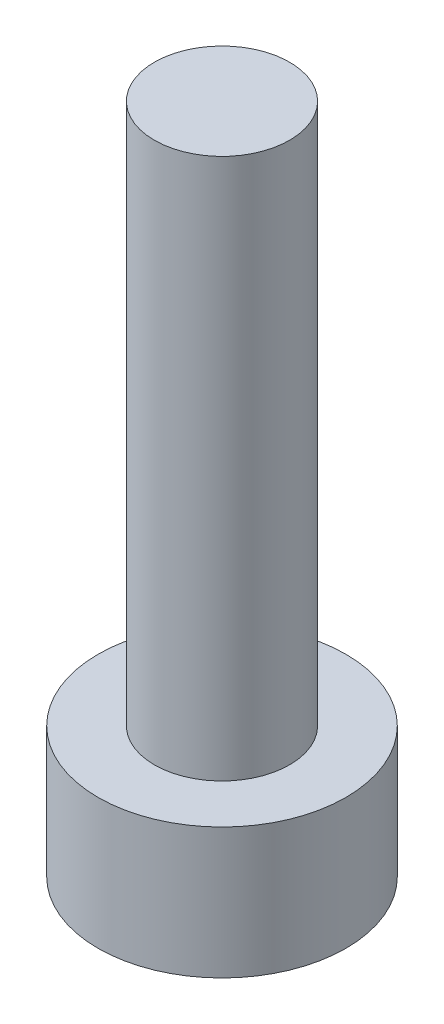
ISO-10303-21;
HEADER;
FILE_DESCRIPTION(('STEP AP214'),'2;1');
FILE_NAME('part.step','',(''),(''),'','','');
FILE_SCHEMA(('AUTOMOTIVE_DESIGN { 1 0 10303 214 1 1 1 1 }'));
ENDSEC;
DATA;
#1=APPLICATION_CONTEXT('core data for automotive mechanical design processes');
#2=APPLICATION_PROTOCOL_DEFINITION('international standard','automotive_design',2000,#1);
#3=PRODUCT_CONTEXT('',#1,'mechanical');
#4=PRODUCT('Part','Part','',(#3));
#5=PRODUCT_RELATED_PRODUCT_CATEGORY('part','',(#4));
#6=PRODUCT_DEFINITION_FORMATION('','',#4);
#7=PRODUCT_DEFINITION_CONTEXT('part definition',#1,'design');
#8=PRODUCT_DEFINITION('design','',#6,#7);
#9=PRODUCT_DEFINITION_SHAPE('','',#8);
#10=(LENGTH_UNIT() NAMED_UNIT(*) SI_UNIT(.MILLI.,.METRE.));
#11=(NAMED_UNIT(*) PLANE_ANGLE_UNIT() SI_UNIT($,.RADIAN.));
#12=(NAMED_UNIT(*) SI_UNIT($,.STERADIAN.) SOLID_ANGLE_UNIT());
#13=UNCERTAINTY_MEASURE_WITH_UNIT(LENGTH_MEASURE(1.E-05),#10,'distance_accuracy_value','');
#14=(GEOMETRIC_REPRESENTATION_CONTEXT(3) GLOBAL_UNCERTAINTY_ASSIGNED_CONTEXT((#13)) GLOBAL_UNIT_ASSIGNED_CONTEXT((#10,
#11,#12)) REPRESENTATION_CONTEXT('',''));
#15=CARTESIAN_POINT('',(0.,0.,0.));
#16=DIRECTION('',(0.,0.,1.));
#17=DIRECTION('',(1.,0.,0.));
#18=AXIS2_PLACEMENT_3D('',#15,#16,#17);
#19=CARTESIAN_POINT('',(0.,12.,0.));
#20=DIRECTION('',(0.,-1.,0.));
#21=DIRECTION('',(0.,0.,-1.));
#22=AXIS2_PLACEMENT_3D('',#19,#20,#21);
#23=CYLINDRICAL_SURFACE('',#22,1.5);
#24=CARTESIAN_POINT('',(0.,12.,0.));
#25=DIRECTION('',(0.,1.,0.));
#26=DIRECTION('',(0.,0.,1.));
#27=AXIS2_PLACEMENT_3D('',#24,#25,#26);
#28=CIRCLE('',#27,1.5);
#29=CARTESIAN_POINT('',(0.,12.,1.5));
#30=VERTEX_POINT('',#29);
#31=EDGE_CURVE('E11',#30,#30,#28,.T.);
#32=ORIENTED_EDGE('',*,*,#31,.F.);
#33=EDGE_LOOP('',(#32));
#34=FACE_BOUND('',#33,.T.);
#35=CARTESIAN_POINT('',(0.,0.,0.));
#36=DIRECTION('',(0.,1.,0.));
#37=DIRECTION('',(0.,0.,1.));
#38=AXIS2_PLACEMENT_3D('',#35,#36,#37);
#39=CIRCLE('',#38,1.5);
#40=CARTESIAN_POINT('',(0.,0.,1.5));
#41=VERTEX_POINT('',#40);
#42=EDGE_CURVE('E44',#41,#41,#39,.T.);
#43=ORIENTED_EDGE('',*,*,#42,.T.);
#44=EDGE_LOOP('',(#43));
#45=FACE_BOUND('',#44,.T.);
#46=ADVANCED_FACE('F41',(#34,#45),#23,.T.);
#47=CARTESIAN_POINT('',(0.,12.,0.));
#48=DIRECTION('',(0.,1.,0.));
#49=DIRECTION('',(0.,0.,1.));
#50=AXIS2_PLACEMENT_3D('',#47,#48,#49);
#51=PLANE('',#50);
#52=ORIENTED_EDGE('',*,*,#31,.T.);
#53=EDGE_LOOP('',(#52));
#54=FACE_BOUND('',#53,.T.);
#55=ADVANCED_FACE('F174',(#54),#51,.T.);
#56=CARTESIAN_POINT('',(0.,-2.9,0.));
#57=DIRECTION('',(0.,1.,0.));
#58=DIRECTION('',(0.,0.,1.));
#59=AXIS2_PLACEMENT_3D('',#56,#57,#58);
#60=CYLINDRICAL_SURFACE('',#59,2.75);
#61=CARTESIAN_POINT('',(0.,-2.9,0.));
#62=DIRECTION('',(0.,-1.,0.));
#63=DIRECTION('',(0.,0.,-1.));
#64=AXIS2_PLACEMENT_3D('',#61,#62,#63);
#65=CIRCLE('',#64,2.75);
#66=CARTESIAN_POINT('',(0.,-2.9,-2.75));
#67=VERTEX_POINT('',#66);
#68=EDGE_CURVE('E148',#67,#67,#65,.T.);
#69=ORIENTED_EDGE('',*,*,#68,.F.);
#70=EDGE_LOOP('',(#69));
#71=FACE_BOUND('',#70,.T.);
#72=CARTESIAN_POINT('',(0.,0.,0.));
#73=DIRECTION('',(0.,-1.,0.));
#74=DIRECTION('',(0.,0.,-1.));
#75=AXIS2_PLACEMENT_3D('',#72,#73,#74);
#76=CIRCLE('',#75,2.75);
#77=CARTESIAN_POINT('',(0.,0.,-2.75));
#78=VERTEX_POINT('',#77);
#79=EDGE_CURVE('E142',#78,#78,#76,.T.);
#80=ORIENTED_EDGE('',*,*,#79,.T.);
#81=EDGE_LOOP('',(#80));
#82=FACE_BOUND('',#81,.T.);
#83=ADVANCED_FACE('F154',(#71,#82),#60,.T.);
#84=CARTESIAN_POINT('',(0.,-2.9,0.));
#85=DIRECTION('',(0.,-1.,0.));
#86=DIRECTION('',(0.,0.,-1.));
#87=AXIS2_PLACEMENT_3D('',#84,#85,#86);
#88=PLANE('',#87);
#89=DIRECTION('',(0.,0.,1.));
#90=VECTOR('',#89,1.);
#91=CARTESIAN_POINT('',(1.25,-2.9,-0.721687836487033));
#92=LINE('',#91,#90);
#93=CARTESIAN_POINT('',(1.25,-2.9,-0.721687836487033));
#94=VERTEX_POINT('',#93);
#95=CARTESIAN_POINT('',(1.25,-2.9,0.721687836487032));
#96=VERTEX_POINT('',#95);
#97=EDGE_CURVE('E55',#94,#96,#92,.T.);
#98=ORIENTED_EDGE('',*,*,#97,.F.);
#99=DIRECTION('',(0.866025403784439,0.,0.5));
#100=VECTOR('',#99,1.);
#101=CARTESIAN_POINT('',(0.,-2.9,-1.44337567297406));
#102=LINE('',#101,#100);
#103=CARTESIAN_POINT('',(0.,-2.9,-1.44337567297406));
#104=VERTEX_POINT('',#103);
#105=EDGE_CURVE('E138',#104,#94,#102,.T.);
#106=ORIENTED_EDGE('',*,*,#105,.F.);
#107=DIRECTION('',(0.866025403784438,0.,-0.5));
#108=VECTOR('',#107,1.);
#109=CARTESIAN_POINT('',(-1.25,-2.9,-0.721687836487032));
#110=LINE('',#109,#108);
#111=CARTESIAN_POINT('',(-1.25,-2.9,-0.721687836487032));
#112=VERTEX_POINT('',#111);
#113=EDGE_CURVE('E136',#112,#104,#110,.T.);
#114=ORIENTED_EDGE('',*,*,#113,.F.);
#115=DIRECTION('',(0.,0.,-1.));
#116=VECTOR('',#115,1.);
#117=CARTESIAN_POINT('',(-1.25,-2.9,0.721687836487032));
#118=LINE('',#117,#116);
#119=CARTESIAN_POINT('',(-1.25,-2.9,0.721687836487032));
#120=VERTEX_POINT('',#119);
#121=EDGE_CURVE('E103',#120,#112,#118,.T.);
#122=ORIENTED_EDGE('',*,*,#121,.F.);
#123=DIRECTION('',(-0.866025403784439,0.,-0.5));
#124=VECTOR('',#123,1.);
#125=CARTESIAN_POINT('',(0.,-2.9,1.44337567297406));
#126=LINE('',#125,#124);
#127=CARTESIAN_POINT('',(0.,-2.9,1.44337567297406));
#128=VERTEX_POINT('',#127);
#129=EDGE_CURVE('E132',#128,#120,#126,.T.);
#130=ORIENTED_EDGE('',*,*,#129,.F.);
#131=DIRECTION('',(-0.866025403784439,0.,0.5));
#132=VECTOR('',#131,1.);
#133=CARTESIAN_POINT('',(1.25,-2.9,0.721687836487032));
#134=LINE('',#133,#132);
#135=EDGE_CURVE('E129',#96,#128,#134,.T.);
#136=ORIENTED_EDGE('',*,*,#135,.F.);
#137=EDGE_LOOP('',(#98,#106,#114,#122,#130,#136));
#138=FACE_BOUND('',#137,.T.);
#139=ORIENTED_EDGE('',*,*,#68,.T.);
#140=EDGE_LOOP('',(#139));
#141=FACE_BOUND('',#140,.T.);
#142=ADVANCED_FACE('F159',(#138,#141),#88,.T.);
#143=CARTESIAN_POINT('',(0.,0.,0.));
#144=DIRECTION('',(0.,-1.,0.));
#145=DIRECTION('',(0.,0.,-1.));
#146=AXIS2_PLACEMENT_3D('',#143,#144,#145);
#147=PLANE('',#146);
#148=ORIENTED_EDGE('',*,*,#42,.F.);
#149=EDGE_LOOP('',(#148));
#150=FACE_BOUND('',#149,.T.);
#151=ORIENTED_EDGE('',*,*,#79,.F.);
#152=EDGE_LOOP('',(#151));
#153=FACE_BOUND('',#152,.T.);
#154=ADVANCED_FACE('F156',(#150,#153),#147,.F.);
#155=CARTESIAN_POINT('',(1.25,-1.4,-0.721687836487033));
#156=DIRECTION('',(1.,0.,0.));
#157=DIRECTION('',(0.,0.,-1.));
#158=AXIS2_PLACEMENT_3D('',#155,#156,#157);
#159=PLANE('',#158);
#160=ORIENTED_EDGE('',*,*,#97,.T.);
#161=DIRECTION('',(0.,-1.,0.));
#162=VECTOR('',#161,1.);
#163=CARTESIAN_POINT('',(1.25,-1.4,0.721687836487032));
#164=LINE('',#163,#162);
#165=CARTESIAN_POINT('',(1.25,-1.4,0.721687836487032));
#166=VERTEX_POINT('',#165);
#167=EDGE_CURVE('E85',#166,#96,#164,.T.);
#168=ORIENTED_EDGE('',*,*,#167,.F.);
#169=DIRECTION('',(0.,0.,1.));
#170=VECTOR('',#169,1.);
#171=CARTESIAN_POINT('',(1.25,-1.4,-0.721687836487033));
#172=LINE('',#171,#170);
#173=CARTESIAN_POINT('',(1.25,-1.4,-0.721687836487033));
#174=VERTEX_POINT('',#173);
#175=EDGE_CURVE('E140',#174,#166,#172,.T.);
#176=ORIENTED_EDGE('',*,*,#175,.F.);
#177=DIRECTION('',(0.,-1.,0.));
#178=VECTOR('',#177,1.);
#179=CARTESIAN_POINT('',(1.25,-1.4,-0.721687836487033));
#180=LINE('',#179,#178);
#181=EDGE_CURVE('E63',#174,#94,#180,.T.);
#182=ORIENTED_EDGE('',*,*,#181,.T.);
#183=EDGE_LOOP('',(#160,#168,#176,#182));
#184=FACE_BOUND('',#183,.T.);
#185=ADVANCED_FACE('F158',(#184),#159,.F.);
#186=CARTESIAN_POINT('',(0.,-1.4,-1.44337567297406));
#187=DIRECTION('',(0.5,0.,-0.866025403784439));
#188=DIRECTION('',(-0.866025403784439,0.,-0.5));
#189=AXIS2_PLACEMENT_3D('',#186,#187,#188);
#190=PLANE('',#189);
#191=ORIENTED_EDGE('',*,*,#105,.T.);
#192=ORIENTED_EDGE('',*,*,#181,.F.);
#193=DIRECTION('',(0.866025403784439,0.,0.5));
#194=VECTOR('',#193,1.);
#195=CARTESIAN_POINT('',(0.,-1.4,-1.44337567297406));
#196=LINE('',#195,#194);
#197=CARTESIAN_POINT('',(0.,-1.4,-1.44337567297406));
#198=VERTEX_POINT('',#197);
#199=EDGE_CURVE('E115',#198,#174,#196,.T.);
#200=ORIENTED_EDGE('',*,*,#199,.F.);
#201=DIRECTION('',(0.,-1.,0.));
#202=VECTOR('',#201,1.);
#203=CARTESIAN_POINT('',(0.,-1.4,-1.44337567297406));
#204=LINE('',#203,#202);
#205=EDGE_CURVE('E107',#198,#104,#204,.T.);
#206=ORIENTED_EDGE('',*,*,#205,.T.);
#207=EDGE_LOOP('',(#191,#192,#200,#206));
#208=FACE_BOUND('',#207,.T.);
#209=ADVANCED_FACE('F167',(#208),#190,.F.);
#210=CARTESIAN_POINT('',(-1.25,-1.4,-0.721687836487032));
#211=DIRECTION('',(-0.5,0.,-0.866025403784439));
#212=DIRECTION('',(-0.866025403784439,0.,0.5));
#213=AXIS2_PLACEMENT_3D('',#210,#211,#212);
#214=PLANE('',#213);
#215=ORIENTED_EDGE('',*,*,#113,.T.);
#216=ORIENTED_EDGE('',*,*,#205,.F.);
#217=DIRECTION('',(0.866025403784438,0.,-0.5));
#218=VECTOR('',#217,1.);
#219=CARTESIAN_POINT('',(-1.25,-1.4,-0.721687836487032));
#220=LINE('',#219,#218);
#221=CARTESIAN_POINT('',(-1.25,-1.4,-0.721687836487032));
#222=VERTEX_POINT('',#221);
#223=EDGE_CURVE('E111',#222,#198,#220,.T.);
#224=ORIENTED_EDGE('',*,*,#223,.F.);
#225=DIRECTION('',(0.,-1.,0.));
#226=VECTOR('',#225,1.);
#227=CARTESIAN_POINT('',(-1.25,-1.4,-0.721687836487032));
#228=LINE('',#227,#226);
#229=EDGE_CURVE('E96',#222,#112,#228,.T.);
#230=ORIENTED_EDGE('',*,*,#229,.T.);
#231=EDGE_LOOP('',(#215,#216,#224,#230));
#232=FACE_BOUND('',#231,.T.);
#233=ADVANCED_FACE('F112',(#232),#214,.F.);
#234=CARTESIAN_POINT('',(-1.25,-1.4,0.721687836487032));
#235=DIRECTION('',(-1.,0.,0.));
#236=DIRECTION('',(0.,0.,1.));
#237=AXIS2_PLACEMENT_3D('',#234,#235,#236);
#238=PLANE('',#237);
#239=ORIENTED_EDGE('',*,*,#121,.T.);
#240=ORIENTED_EDGE('',*,*,#229,.F.);
#241=DIRECTION('',(0.,0.,-1.));
#242=VECTOR('',#241,1.);
#243=CARTESIAN_POINT('',(-1.25,-1.4,0.721687836487032));
#244=LINE('',#243,#242);
#245=CARTESIAN_POINT('',(-1.25,-1.4,0.721687836487032));
#246=VERTEX_POINT('',#245);
#247=EDGE_CURVE('E100',#246,#222,#244,.T.);
#248=ORIENTED_EDGE('',*,*,#247,.F.);
#249=DIRECTION('',(0.,-1.,0.));
#250=VECTOR('',#249,1.);
#251=CARTESIAN_POINT('',(-1.25,-1.4,0.721687836487032));
#252=LINE('',#251,#250);
#253=EDGE_CURVE('E108',#246,#120,#252,.T.);
#254=ORIENTED_EDGE('',*,*,#253,.T.);
#255=EDGE_LOOP('',(#239,#240,#248,#254));
#256=FACE_BOUND('',#255,.T.);
#257=ADVANCED_FACE('F98',(#256),#238,.F.);
#258=CARTESIAN_POINT('',(0.,-1.4,1.44337567297406));
#259=DIRECTION('',(-0.5,0.,0.866025403784439));
#260=DIRECTION('',(0.866025403784439,0.,0.5));
#261=AXIS2_PLACEMENT_3D('',#258,#259,#260);
#262=PLANE('',#261);
#263=ORIENTED_EDGE('',*,*,#129,.T.);
#264=ORIENTED_EDGE('',*,*,#253,.F.);
#265=DIRECTION('',(-0.866025403784439,0.,-0.5));
#266=VECTOR('',#265,1.);
#267=CARTESIAN_POINT('',(0.,-1.4,1.44337567297406));
#268=LINE('',#267,#266);
#269=CARTESIAN_POINT('',(0.,-1.4,1.44337567297406));
#270=VERTEX_POINT('',#269);
#271=EDGE_CURVE('E121',#270,#246,#268,.T.);
#272=ORIENTED_EDGE('',*,*,#271,.F.);
#273=DIRECTION('',(0.,-1.,0.));
#274=VECTOR('',#273,1.);
#275=CARTESIAN_POINT('',(0.,-1.4,1.44337567297406));
#276=LINE('',#275,#274);
#277=EDGE_CURVE('E145',#270,#128,#276,.T.);
#278=ORIENTED_EDGE('',*,*,#277,.T.);
#279=EDGE_LOOP('',(#263,#264,#272,#278));
#280=FACE_BOUND('',#279,.T.);
#281=ADVANCED_FACE('F235',(#280),#262,.F.);
#282=CARTESIAN_POINT('',(1.25,-1.4,0.721687836487032));
#283=DIRECTION('',(0.5,0.,0.866025403784439));
#284=DIRECTION('',(0.866025403784439,0.,-0.5));
#285=AXIS2_PLACEMENT_3D('',#282,#283,#284);
#286=PLANE('',#285);
#287=ORIENTED_EDGE('',*,*,#135,.T.);
#288=ORIENTED_EDGE('',*,*,#277,.F.);
#289=DIRECTION('',(-0.866025403784439,0.,0.5));
#290=VECTOR('',#289,1.);
#291=CARTESIAN_POINT('',(1.25,-1.4,0.721687836487032));
#292=LINE('',#291,#290);
#293=EDGE_CURVE('E123',#166,#270,#292,.T.);
#294=ORIENTED_EDGE('',*,*,#293,.F.);
#295=ORIENTED_EDGE('',*,*,#167,.T.);
#296=EDGE_LOOP('',(#287,#288,#294,#295));
#297=FACE_BOUND('',#296,.T.);
#298=ADVANCED_FACE('F244',(#297),#286,.F.);
#299=CARTESIAN_POINT('',(0.,-1.4,0.));
#300=DIRECTION('',(0.,-1.,0.));
#301=DIRECTION('',(0.,0.,-1.));
#302=AXIS2_PLACEMENT_3D('',#299,#300,#301);
#303=PLANE('',#302);
#304=ORIENTED_EDGE('',*,*,#175,.T.);
#305=ORIENTED_EDGE('',*,*,#293,.T.);
#306=ORIENTED_EDGE('',*,*,#271,.T.);
#307=ORIENTED_EDGE('',*,*,#247,.T.);
#308=ORIENTED_EDGE('',*,*,#223,.T.);
#309=ORIENTED_EDGE('',*,*,#199,.T.);
#310=EDGE_LOOP('',(#304,#305,#306,#307,#308,#309));
#311=FACE_BOUND('',#310,.T.);
#312=ADVANCED_FACE('F118',(#311),#303,.T.);
#313=CLOSED_SHELL('',(#46,#55,#83,#142,#154,#185,#209,#233,#257,#281,#298,#312));
#314=MANIFOLD_SOLID_BREP('B2',#313);
#315=ADVANCED_BREP_SHAPE_REPRESENTATION('',(#18,#314),#14);
#316=SHAPE_DEFINITION_REPRESENTATION(#9,#315);
ENDSEC;
END-ISO-10303-21;
